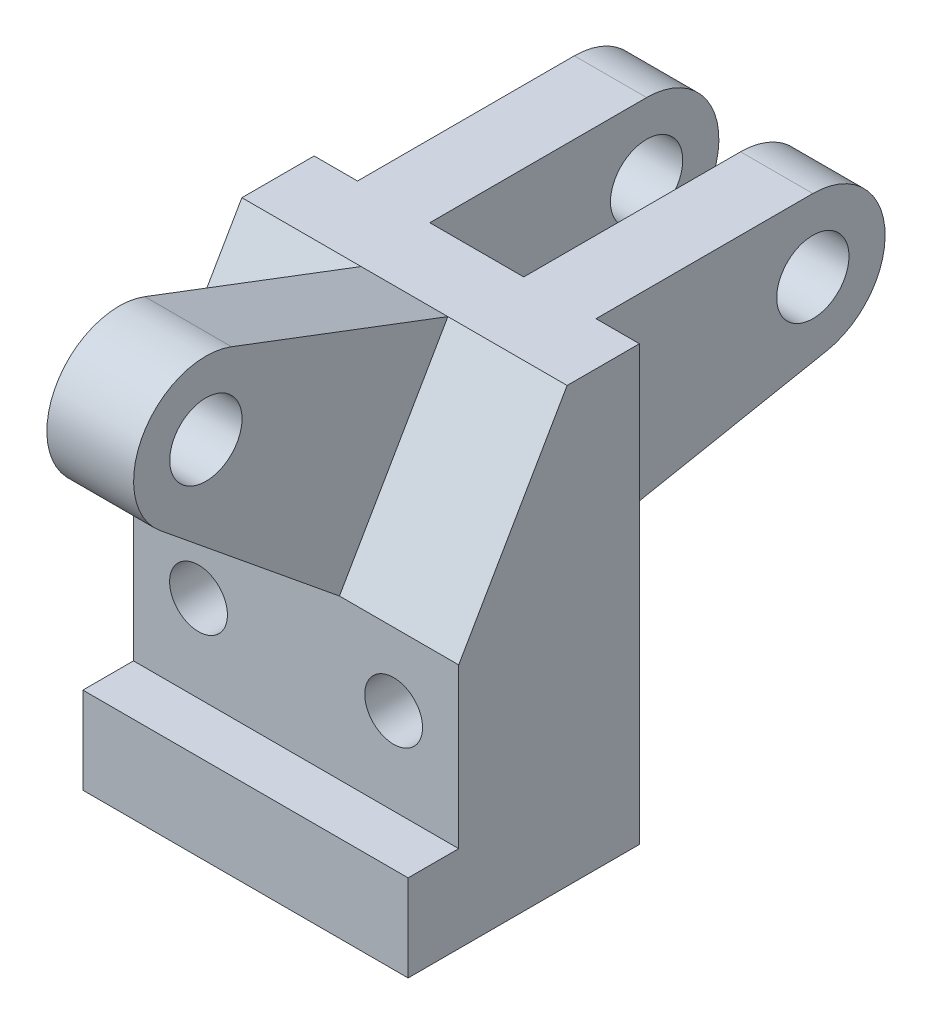
ISO-10303-21;
HEADER;
FILE_DESCRIPTION(('STEP AP214'),'2;1');
FILE_NAME('part.step','',(''),(''),'','','');
FILE_SCHEMA(('AUTOMOTIVE_DESIGN { 1 0 10303 214 1 1 1 1 }'));
ENDSEC;
DATA;
#1=APPLICATION_CONTEXT('core data for automotive mechanical design processes');
#2=APPLICATION_PROTOCOL_DEFINITION('international standard','automotive_design',2000,#1);
#3=PRODUCT_CONTEXT('',#1,'mechanical');
#4=PRODUCT('Part','Part','',(#3));
#5=PRODUCT_RELATED_PRODUCT_CATEGORY('part','',(#4));
#6=PRODUCT_DEFINITION_FORMATION('','',#4);
#7=PRODUCT_DEFINITION_CONTEXT('part definition',#1,'design');
#8=PRODUCT_DEFINITION('design','',#6,#7);
#9=PRODUCT_DEFINITION_SHAPE('','',#8);
#10=(LENGTH_UNIT() NAMED_UNIT(*) SI_UNIT(.MILLI.,.METRE.));
#11=(NAMED_UNIT(*) PLANE_ANGLE_UNIT() SI_UNIT($,.RADIAN.));
#12=(NAMED_UNIT(*) SI_UNIT($,.STERADIAN.) SOLID_ANGLE_UNIT());
#13=UNCERTAINTY_MEASURE_WITH_UNIT(LENGTH_MEASURE(1.E-05),#10,'distance_accuracy_value','');
#14=(GEOMETRIC_REPRESENTATION_CONTEXT(3) GLOBAL_UNCERTAINTY_ASSIGNED_CONTEXT((#13)) GLOBAL_UNIT_ASSIGNED_CONTEXT((#10,
#11,#12)) REPRESENTATION_CONTEXT('',''));
#15=CARTESIAN_POINT('',(0.,0.,0.));
#16=DIRECTION('',(0.,0.,1.));
#17=DIRECTION('',(1.,0.,0.));
#18=AXIS2_PLACEMENT_3D('',#15,#16,#17);
#19=CARTESIAN_POINT('',(-22.5,34.0192378864669,25.));
#20=DIRECTION('',(0.,0.500000000000001,0.866025403784438));
#21=DIRECTION('',(0.,-0.866025403784438,0.500000000000001));
#22=AXIS2_PLACEMENT_3D('',#19,#20,#21);
#23=PLANE('',#22);
#24=DIRECTION('',(1.,0.,0.));
#25=VECTOR('',#24,1.);
#26=CARTESIAN_POINT('',(-22.5,34.0192378864669,25.));
#27=LINE('',#26,#25);
#28=CARTESIAN_POINT('',(-22.5,34.0192378864669,25.));
#29=VERTEX_POINT('',#28);
#30=CARTESIAN_POINT('',(-6.00000000000001,34.0192378864669,25.));
#31=VERTEX_POINT('',#30);
#32=EDGE_CURVE('E329',#29,#31,#27,.T.);
#33=ORIENTED_EDGE('',*,*,#32,.T.);
#34=DIRECTION('',(0.,0.866025403784438,-0.500000000000001));
#35=VECTOR('',#34,1.);
#36=CARTESIAN_POINT('',(-6.,60.,10.));
#37=LINE('',#36,#35);
#38=CARTESIAN_POINT('',(-6.00000000000001,60.,10.));
#39=VERTEX_POINT('',#38);
#40=EDGE_CURVE('E209',#31,#39,#37,.T.);
#41=ORIENTED_EDGE('',*,*,#40,.T.);
#42=DIRECTION('',(1.,0.,0.));
#43=VECTOR('',#42,1.);
#44=CARTESIAN_POINT('',(-22.5,60.,10.));
#45=LINE('',#44,#43);
#46=CARTESIAN_POINT('',(-22.5,60.,10.));
#47=VERTEX_POINT('',#46);
#48=EDGE_CURVE('E172',#47,#39,#45,.T.);
#49=ORIENTED_EDGE('',*,*,#48,.F.);
#50=DIRECTION('',(0.,-0.866025403784438,0.500000000000001));
#51=VECTOR('',#50,1.);
#52=CARTESIAN_POINT('',(-22.5,34.0192378864669,25.));
#53=LINE('',#52,#51);
#54=EDGE_CURVE('E287',#47,#29,#53,.T.);
#55=ORIENTED_EDGE('',*,*,#54,.T.);
#56=EDGE_LOOP('',(#33,#41,#49,#55));
#57=FACE_BOUND('',#56,.T.);
#58=ADVANCED_FACE('F33',(#57),#23,.T.);
#59=CARTESIAN_POINT('',(16.5,40.1826590955336,-31.9025818157154));
#60=DIRECTION('',(0.,0.98173409044664,0.190258181571541));
#61=DIRECTION('',(0.,-0.190258181571541,0.98173409044664));
#62=AXIS2_PLACEMENT_3D('',#59,#60,#61);
#63=PLANE('',#62);
#64=DIRECTION('',(-1.,0.,0.));
#65=VECTOR('',#64,1.);
#66=CARTESIAN_POINT('',(16.5,34.,0.));
#67=LINE('',#66,#65);
#68=CARTESIAN_POINT('',(16.5,34.,0.));
#69=VERTEX_POINT('',#68);
#70=CARTESIAN_POINT('',(6.5,34.,0.));
#71=VERTEX_POINT('',#70);
#72=EDGE_CURVE('E281',#69,#71,#67,.T.);
#73=ORIENTED_EDGE('',*,*,#72,.T.);
#74=DIRECTION('',(0.,0.190258181571541,-0.98173409044664));
#75=VECTOR('',#74,1.);
#76=CARTESIAN_POINT('',(6.5,40.1826590955336,-31.9025818157154));
#77=LINE('',#76,#75);
#78=CARTESIAN_POINT('',(6.5,40.1826590955336,-31.9025818157154));
#79=VERTEX_POINT('',#78);
#80=EDGE_CURVE('E241',#71,#79,#77,.T.);
#81=ORIENTED_EDGE('',*,*,#80,.T.);
#82=DIRECTION('',(-1.,0.,0.));
#83=VECTOR('',#82,1.);
#84=CARTESIAN_POINT('',(16.5,40.1826590955336,-31.9025818157154));
#85=LINE('',#84,#83);
#86=CARTESIAN_POINT('',(16.5,40.1826590955336,-31.9025818157154));
#87=VERTEX_POINT('',#86);
#88=EDGE_CURVE('E277',#87,#79,#85,.T.);
#89=ORIENTED_EDGE('',*,*,#88,.F.);
#90=DIRECTION('',(0.,0.190258181571541,-0.98173409044664));
#91=VECTOR('',#90,1.);
#92=CARTESIAN_POINT('',(16.5,40.1826590955336,-31.9025818157154));
#93=LINE('',#92,#91);
#94=EDGE_CURVE('E254',#69,#87,#93,.T.);
#95=ORIENTED_EDGE('',*,*,#94,.F.);
#96=EDGE_LOOP('',(#73,#81,#89,#95));
#97=FACE_BOUND('',#96,.T.);
#98=ADVANCED_FACE('F358',(#97),#63,.F.);
#99=CARTESIAN_POINT('',(16.5,50.,-30.));
#100=DIRECTION('',(-1.,0.,0.));
#101=DIRECTION('',(0.,0.,1.));
#102=AXIS2_PLACEMENT_3D('',#99,#100,#101);
#103=CYLINDRICAL_SURFACE('',#102,10.);
#104=ORIENTED_EDGE('',*,*,#88,.T.);
#105=CARTESIAN_POINT('',(6.5,50.,-30.));
#106=DIRECTION('',(1.,0.,0.));
#107=DIRECTION('',(0.,0.,-1.));
#108=AXIS2_PLACEMENT_3D('',#105,#106,#107);
#109=CIRCLE('',#108,10.);
#110=CARTESIAN_POINT('',(6.5,60.,-30.));
#111=VERTEX_POINT('',#110);
#112=EDGE_CURVE('E238',#79,#111,#109,.T.);
#113=ORIENTED_EDGE('',*,*,#112,.T.);
#114=DIRECTION('',(-1.,0.,0.));
#115=VECTOR('',#114,1.);
#116=CARTESIAN_POINT('',(16.5,60.,-30.));
#117=LINE('',#116,#115);
#118=CARTESIAN_POINT('',(16.5,60.,-30.));
#119=VERTEX_POINT('',#118);
#120=EDGE_CURVE('E273',#119,#111,#117,.T.);
#121=ORIENTED_EDGE('',*,*,#120,.F.);
#122=CARTESIAN_POINT('',(16.5,50.,-30.));
#123=DIRECTION('',(1.,0.,0.));
#124=DIRECTION('',(0.,0.,1.));
#125=AXIS2_PLACEMENT_3D('',#122,#123,#124);
#126=CIRCLE('',#125,10.);
#127=EDGE_CURVE('E257',#87,#119,#126,.T.);
#128=ORIENTED_EDGE('',*,*,#127,.F.);
#129=EDGE_LOOP('',(#104,#113,#121,#128));
#130=FACE_BOUND('',#129,.T.);
#131=ADVANCED_FACE('F369',(#130),#103,.T.);
#132=CARTESIAN_POINT('',(16.5,50.,-30.));
#133=DIRECTION('',(-1.,0.,0.));
#134=DIRECTION('',(0.,0.,1.));
#135=AXIS2_PLACEMENT_3D('',#132,#133,#134);
#136=CYLINDRICAL_SURFACE('',#135,5.);
#137=CARTESIAN_POINT('',(6.5,50.,-30.));
#138=DIRECTION('',(1.,0.,0.));
#139=DIRECTION('',(0.,0.,-1.));
#140=AXIS2_PLACEMENT_3D('',#137,#138,#139);
#141=CIRCLE('',#140,5.);
#142=CARTESIAN_POINT('',(6.5,50.,-35.));
#143=VERTEX_POINT('',#142);
#144=EDGE_CURVE('E37',#143,#143,#141,.T.);
#145=ORIENTED_EDGE('',*,*,#144,.F.);
#146=EDGE_LOOP('',(#145));
#147=FACE_BOUND('',#146,.T.);
#148=CARTESIAN_POINT('',(16.5,50.,-30.));
#149=DIRECTION('',(1.,0.,0.));
#150=DIRECTION('',(0.,0.,-1.));
#151=AXIS2_PLACEMENT_3D('',#148,#149,#150);
#152=CIRCLE('',#151,5.);
#153=CARTESIAN_POINT('',(16.5,50.,-35.));
#154=VERTEX_POINT('',#153);
#155=EDGE_CURVE('E245',#154,#154,#152,.T.);
#156=ORIENTED_EDGE('',*,*,#155,.T.);
#157=EDGE_LOOP('',(#156));
#158=FACE_BOUND('',#157,.T.);
#159=ADVANCED_FACE('F343',(#147,#158),#136,.F.);
#160=CARTESIAN_POINT('',(-22.5,60.,0.));
#161=DIRECTION('',(0.,0.,-1.));
#162=DIRECTION('',(0.,1.,0.));
#163=AXIS2_PLACEMENT_3D('',#160,#161,#162);
#164=PLANE('',#163);
#165=CARTESIAN_POINT('',(13.5,24.,0.));
#166=DIRECTION('',(0.,0.,-1.));
#167=DIRECTION('',(0.,1.,0.));
#168=AXIS2_PLACEMENT_3D('',#165,#166,#167);
#169=CIRCLE('',#168,4.);
#170=CARTESIAN_POINT('',(13.5,28.,0.));
#171=VERTEX_POINT('',#170);
#172=EDGE_CURVE('E482',#171,#171,#169,.T.);
#173=ORIENTED_EDGE('',*,*,#172,.F.);
#174=EDGE_LOOP('',(#173));
#175=FACE_BOUND('',#174,.T.);
#176=CARTESIAN_POINT('',(-13.5,24.,0.));
#177=DIRECTION('',(0.,0.,-1.));
#178=DIRECTION('',(0.,1.,0.));
#179=AXIS2_PLACEMENT_3D('',#176,#177,#178);
#180=CIRCLE('',#179,4.);
#181=CARTESIAN_POINT('',(-13.5,28.,0.));
#182=VERTEX_POINT('',#181);
#183=EDGE_CURVE('E491',#182,#182,#180,.T.);
#184=ORIENTED_EDGE('',*,*,#183,.F.);
#185=EDGE_LOOP('',(#184));
#186=FACE_BOUND('',#185,.T.);
#187=CARTESIAN_POINT('',(-6.5,34.,0.));
#188=VERTEX_POINT('',#187);
#189=CARTESIAN_POINT('',(-16.5,34.,0.));
#190=VERTEX_POINT('',#189);
#191=EDGE_CURVE('E280',#188,#190,#67,.T.);
#192=ORIENTED_EDGE('',*,*,#191,.F.);
#193=DIRECTION('',(0.,1.,0.));
#194=VECTOR('',#193,1.);
#195=CARTESIAN_POINT('',(-6.5,0.,0.));
#196=LINE('',#195,#194);
#197=CARTESIAN_POINT('',(-6.5,60.,0.));
#198=VERTEX_POINT('',#197);
#199=EDGE_CURVE('E227',#188,#198,#196,.T.);
#200=ORIENTED_EDGE('',*,*,#199,.T.);
#201=DIRECTION('',(1.,0.,0.));
#202=VECTOR('',#201,1.);
#203=CARTESIAN_POINT('',(6.5,60.,0.));
#204=LINE('',#203,#202);
#205=CARTESIAN_POINT('',(6.5,60.,0.));
#206=VERTEX_POINT('',#205);
#207=EDGE_CURVE('E224',#198,#206,#204,.T.);
#208=ORIENTED_EDGE('',*,*,#207,.T.);
#209=DIRECTION('',(0.,1.,0.));
#210=VECTOR('',#209,1.);
#211=CARTESIAN_POINT('',(6.5,0.,0.));
#212=LINE('',#211,#210);
#213=EDGE_CURVE('E228',#71,#206,#212,.T.);
#214=ORIENTED_EDGE('',*,*,#213,.F.);
#215=ORIENTED_EDGE('',*,*,#72,.F.);
#216=DIRECTION('',(0.,-1.,0.));
#217=VECTOR('',#216,1.);
#218=CARTESIAN_POINT('',(16.5,60.,0.));
#219=LINE('',#218,#217);
#220=CARTESIAN_POINT('',(16.5,60.,0.));
#221=VERTEX_POINT('',#220);
#222=EDGE_CURVE('E251',#221,#69,#219,.T.);
#223=ORIENTED_EDGE('',*,*,#222,.F.);
#224=DIRECTION('',(1.,0.,0.));
#225=VECTOR('',#224,1.);
#226=CARTESIAN_POINT('',(-22.5,60.,0.));
#227=LINE('',#226,#225);
#228=CARTESIAN_POINT('',(22.5,60.,0.));
#229=VERTEX_POINT('',#228);
#230=EDGE_CURVE('E42',#221,#229,#227,.T.);
#231=ORIENTED_EDGE('',*,*,#230,.T.);
#232=DIRECTION('',(0.,1.,0.));
#233=VECTOR('',#232,1.);
#234=CARTESIAN_POINT('',(22.5,60.,0.));
#235=LINE('',#234,#233);
#236=CARTESIAN_POINT('',(22.5,0.,0.));
#237=VERTEX_POINT('',#236);
#238=EDGE_CURVE('E288',#237,#229,#235,.T.);
#239=ORIENTED_EDGE('',*,*,#238,.F.);
#240=DIRECTION('',(1.,0.,0.));
#241=VECTOR('',#240,1.);
#242=CARTESIAN_POINT('',(-22.5,0.,0.));
#243=LINE('',#242,#241);
#244=CARTESIAN_POINT('',(-22.5,0.,0.));
#245=VERTEX_POINT('',#244);
#246=EDGE_CURVE('E321',#245,#237,#243,.T.);
#247=ORIENTED_EDGE('',*,*,#246,.F.);
#248=DIRECTION('',(0.,1.,0.));
#249=VECTOR('',#248,1.);
#250=CARTESIAN_POINT('',(-22.5,60.,0.));
#251=LINE('',#250,#249);
#252=CARTESIAN_POINT('',(-22.5,60.,0.));
#253=VERTEX_POINT('',#252);
#254=EDGE_CURVE('E183',#245,#253,#251,.T.);
#255=ORIENTED_EDGE('',*,*,#254,.T.);
#256=CARTESIAN_POINT('',(-16.5,60.,0.));
#257=VERTEX_POINT('',#256);
#258=EDGE_CURVE('E11',#253,#257,#227,.T.);
#259=ORIENTED_EDGE('',*,*,#258,.T.);
#260=DIRECTION('',(0.,-1.,0.));
#261=VECTOR('',#260,1.);
#262=CARTESIAN_POINT('',(-16.5,60.,0.));
#263=LINE('',#262,#261);
#264=EDGE_CURVE('E248',#257,#190,#263,.T.);
#265=ORIENTED_EDGE('',*,*,#264,.T.);
#266=EDGE_LOOP('',(#192,#200,#208,#214,#215,#223,#231,#239,#247,#255,#259,#265));
#267=FACE_BOUND('',#266,.T.);
#268=ADVANCED_FACE('F399',(#175,#186,#267),#164,.T.);
#269=CARTESIAN_POINT('',(-22.5,60.,10.));
#270=DIRECTION('',(0.,1.,0.));
#271=DIRECTION('',(0.,0.,1.));
#272=AXIS2_PLACEMENT_3D('',#269,#270,#271);
#273=PLANE('',#272);
#274=DIRECTION('',(0.,0.,-1.));
#275=VECTOR('',#274,1.);
#276=CARTESIAN_POINT('',(6.5,60.,0.));
#277=LINE('',#276,#275);
#278=EDGE_CURVE('E176',#206,#111,#277,.T.);
#279=ORIENTED_EDGE('',*,*,#278,.F.);
#280=ORIENTED_EDGE('',*,*,#207,.F.);
#281=DIRECTION('',(0.,0.,1.));
#282=VECTOR('',#281,1.);
#283=CARTESIAN_POINT('',(-6.5,60.,0.));
#284=LINE('',#283,#282);
#285=CARTESIAN_POINT('',(-6.5,60.,-30.));
#286=VERTEX_POINT('',#285);
#287=EDGE_CURVE('E221',#286,#198,#284,.T.);
#288=ORIENTED_EDGE('',*,*,#287,.F.);
#289=CARTESIAN_POINT('',(-16.5,60.,-30.));
#290=VERTEX_POINT('',#289);
#291=EDGE_CURVE('E262',#286,#290,#117,.T.);
#292=ORIENTED_EDGE('',*,*,#291,.T.);
#293=DIRECTION('',(0.,0.,1.));
#294=VECTOR('',#293,1.);
#295=CARTESIAN_POINT('',(-16.5,60.,0.));
#296=LINE('',#295,#294);
#297=EDGE_CURVE('E255',#290,#257,#296,.T.);
#298=ORIENTED_EDGE('',*,*,#297,.T.);
#299=ORIENTED_EDGE('',*,*,#258,.F.);
#300=DIRECTION('',(0.,0.,1.));
#301=VECTOR('',#300,1.);
#302=CARTESIAN_POINT('',(-22.5,60.,10.));
#303=LINE('',#302,#301);
#304=EDGE_CURVE('E285',#253,#47,#303,.T.);
#305=ORIENTED_EDGE('',*,*,#304,.T.);
#306=ORIENTED_EDGE('',*,*,#48,.T.);
#307=DIRECTION('',(-1.,0.,0.));
#308=VECTOR('',#307,1.);
#309=CARTESIAN_POINT('',(6.,60.,10.));
#310=LINE('',#309,#308);
#311=CARTESIAN_POINT('',(6.,60.,10.));
#312=VERTEX_POINT('',#311);
#313=EDGE_CURVE('E166',#312,#39,#310,.T.);
#314=ORIENTED_EDGE('',*,*,#313,.F.);
#315=CARTESIAN_POINT('',(22.5,60.,10.));
#316=VERTEX_POINT('',#315);
#317=EDGE_CURVE('E169',#312,#316,#45,.T.);
#318=ORIENTED_EDGE('',*,*,#317,.T.);
#319=DIRECTION('',(0.,0.,1.));
#320=VECTOR('',#319,1.);
#321=CARTESIAN_POINT('',(22.5,60.,10.));
#322=LINE('',#321,#320);
#323=EDGE_CURVE('E284',#229,#316,#322,.T.);
#324=ORIENTED_EDGE('',*,*,#323,.F.);
#325=ORIENTED_EDGE('',*,*,#230,.F.);
#326=DIRECTION('',(0.,0.,1.));
#327=VECTOR('',#326,1.);
#328=CARTESIAN_POINT('',(16.5,60.,0.));
#329=LINE('',#328,#327);
#330=EDGE_CURVE('E259',#119,#221,#329,.T.);
#331=ORIENTED_EDGE('',*,*,#330,.F.);
#332=ORIENTED_EDGE('',*,*,#120,.T.);
#333=EDGE_LOOP('',(#279,#280,#288,#292,#298,#299,#305,#306,#314,#318,#324,#325,#331,#332));
#334=FACE_BOUND('',#333,.T.);
#335=ADVANCED_FACE('F35',(#334),#273,.T.);
#336=CARTESIAN_POINT('',(-22.5,0.,0.));
#337=DIRECTION('',(0.,-1.,0.));
#338=DIRECTION('',(0.,0.,-1.));
#339=AXIS2_PLACEMENT_3D('',#336,#337,#338);
#340=PLANE('',#339);
#341=DIRECTION('',(0.,0.,-1.));
#342=VECTOR('',#341,1.);
#343=CARTESIAN_POINT('',(22.5,0.,0.));
#344=LINE('',#343,#342);
#345=CARTESIAN_POINT('',(22.5,0.,32.));
#346=VERTEX_POINT('',#345);
#347=EDGE_CURVE('E316',#346,#237,#344,.T.);
#348=ORIENTED_EDGE('',*,*,#347,.F.);
#349=DIRECTION('',(1.,0.,0.));
#350=VECTOR('',#349,1.);
#351=CARTESIAN_POINT('',(-22.5,0.,32.));
#352=LINE('',#351,#350);
#353=CARTESIAN_POINT('',(-22.5,0.,32.));
#354=VERTEX_POINT('',#353);
#355=EDGE_CURVE('E323',#354,#346,#352,.T.);
#356=ORIENTED_EDGE('',*,*,#355,.F.);
#357=DIRECTION('',(0.,0.,-1.));
#358=VECTOR('',#357,1.);
#359=CARTESIAN_POINT('',(-22.5,0.,0.));
#360=LINE('',#359,#358);
#361=EDGE_CURVE('E300',#354,#245,#360,.T.);
#362=ORIENTED_EDGE('',*,*,#361,.T.);
#363=ORIENTED_EDGE('',*,*,#246,.T.);
#364=EDGE_LOOP('',(#348,#356,#362,#363));
#365=FACE_BOUND('',#364,.T.);
#366=ADVANCED_FACE('F394',(#365),#340,.T.);
#367=CARTESIAN_POINT('',(-22.5,0.,32.));
#368=DIRECTION('',(0.,0.,1.));
#369=DIRECTION('',(1.,0.,0.));
#370=AXIS2_PLACEMENT_3D('',#367,#368,#369);
#371=PLANE('',#370);
#372=DIRECTION('',(0.,-1.,0.));
#373=VECTOR('',#372,1.);
#374=CARTESIAN_POINT('',(22.5,0.,32.));
#375=LINE('',#374,#373);
#376=CARTESIAN_POINT('',(22.5,12.,32.));
#377=VERTEX_POINT('',#376);
#378=EDGE_CURVE('E313',#377,#346,#375,.T.);
#379=ORIENTED_EDGE('',*,*,#378,.F.);
#380=DIRECTION('',(1.,0.,0.));
#381=VECTOR('',#380,1.);
#382=CARTESIAN_POINT('',(-22.5,12.,32.));
#383=LINE('',#382,#381);
#384=CARTESIAN_POINT('',(-22.5,12.,32.));
#385=VERTEX_POINT('',#384);
#386=EDGE_CURVE('E325',#385,#377,#383,.T.);
#387=ORIENTED_EDGE('',*,*,#386,.F.);
#388=DIRECTION('',(0.,-1.,0.));
#389=VECTOR('',#388,1.);
#390=CARTESIAN_POINT('',(-22.5,0.,32.));
#391=LINE('',#390,#389);
#392=EDGE_CURVE('E297',#385,#354,#391,.T.);
#393=ORIENTED_EDGE('',*,*,#392,.T.);
#394=ORIENTED_EDGE('',*,*,#355,.T.);
#395=EDGE_LOOP('',(#379,#387,#393,#394));
#396=FACE_BOUND('',#395,.T.);
#397=ADVANCED_FACE('F386',(#396),#371,.T.);
#398=CARTESIAN_POINT('',(-22.5,12.,32.));
#399=DIRECTION('',(0.,1.,0.));
#400=DIRECTION('',(0.,0.,1.));
#401=AXIS2_PLACEMENT_3D('',#398,#399,#400);
#402=PLANE('',#401);
#403=DIRECTION('',(0.,0.,1.));
#404=VECTOR('',#403,1.);
#405=CARTESIAN_POINT('',(22.5,12.,32.));
#406=LINE('',#405,#404);
#407=CARTESIAN_POINT('',(22.5,12.,25.));
#408=VERTEX_POINT('',#407);
#409=EDGE_CURVE('E310',#408,#377,#406,.T.);
#410=ORIENTED_EDGE('',*,*,#409,.F.);
#411=DIRECTION('',(1.,0.,0.));
#412=VECTOR('',#411,1.);
#413=CARTESIAN_POINT('',(-22.5,12.,25.));
#414=LINE('',#413,#412);
#415=CARTESIAN_POINT('',(-22.5,12.,25.));
#416=VERTEX_POINT('',#415);
#417=EDGE_CURVE('E327',#416,#408,#414,.T.);
#418=ORIENTED_EDGE('',*,*,#417,.F.);
#419=DIRECTION('',(0.,0.,1.));
#420=VECTOR('',#419,1.);
#421=CARTESIAN_POINT('',(-22.5,12.,32.));
#422=LINE('',#421,#420);
#423=EDGE_CURVE('E294',#416,#385,#422,.T.);
#424=ORIENTED_EDGE('',*,*,#423,.T.);
#425=ORIENTED_EDGE('',*,*,#386,.T.);
#426=EDGE_LOOP('',(#410,#418,#424,#425));
#427=FACE_BOUND('',#426,.T.);
#428=ADVANCED_FACE('F381',(#427),#402,.T.);
#429=CARTESIAN_POINT('',(-22.5,12.,25.));
#430=DIRECTION('',(0.,0.,1.));
#431=DIRECTION('',(1.,0.,0.));
#432=AXIS2_PLACEMENT_3D('',#429,#430,#431);
#433=PLANE('',#432);
#434=CARTESIAN_POINT('',(13.5,24.,25.));
#435=DIRECTION('',(0.,0.,1.));
#436=DIRECTION('',(1.,0.,0.));
#437=AXIS2_PLACEMENT_3D('',#434,#435,#436);
#438=CIRCLE('',#437,4.);
#439=CARTESIAN_POINT('',(17.5,24.,25.));
#440=VERTEX_POINT('',#439);
#441=EDGE_CURVE('E484',#440,#440,#438,.T.);
#442=ORIENTED_EDGE('',*,*,#441,.F.);
#443=EDGE_LOOP('',(#442));
#444=FACE_BOUND('',#443,.T.);
#445=CARTESIAN_POINT('',(-13.5,24.,25.));
#446=DIRECTION('',(0.,0.,1.));
#447=DIRECTION('',(1.,0.,0.));
#448=AXIS2_PLACEMENT_3D('',#445,#446,#447);
#449=CIRCLE('',#448,4.);
#450=CARTESIAN_POINT('',(-9.5,24.,25.));
#451=VERTEX_POINT('',#450);
#452=EDGE_CURVE('E486',#451,#451,#449,.T.);
#453=ORIENTED_EDGE('',*,*,#452,.F.);
#454=EDGE_LOOP('',(#453));
#455=FACE_BOUND('',#454,.T.);
#456=DIRECTION('',(0.,-1.,0.));
#457=VECTOR('',#456,1.);
#458=CARTESIAN_POINT('',(22.5,12.,25.));
#459=LINE('',#458,#457);
#460=CARTESIAN_POINT('',(22.5,34.0192378864669,25.));
#461=VERTEX_POINT('',#460);
#462=EDGE_CURVE('E307',#461,#408,#459,.T.);
#463=ORIENTED_EDGE('',*,*,#462,.F.);
#464=CARTESIAN_POINT('',(5.99999999999999,34.0192378864669,25.));
#465=VERTEX_POINT('',#464);
#466=EDGE_CURVE('E330',#465,#461,#27,.T.);
#467=ORIENTED_EDGE('',*,*,#466,.F.);
#468=DIRECTION('',(-1.,0.,0.));
#469=VECTOR('',#468,1.);
#470=CARTESIAN_POINT('',(6.,34.0192378864669,25.));
#471=LINE('',#470,#469);
#472=EDGE_CURVE('E57',#465,#31,#471,.T.);
#473=ORIENTED_EDGE('',*,*,#472,.T.);
#474=ORIENTED_EDGE('',*,*,#32,.F.);
#475=DIRECTION('',(0.,-1.,0.));
#476=VECTOR('',#475,1.);
#477=CARTESIAN_POINT('',(-22.5,12.,25.));
#478=LINE('',#477,#476);
#479=EDGE_CURVE('E291',#29,#416,#478,.T.);
#480=ORIENTED_EDGE('',*,*,#479,.T.);
#481=ORIENTED_EDGE('',*,*,#417,.T.);
#482=EDGE_LOOP('',(#463,#467,#473,#474,#480,#481));
#483=FACE_BOUND('',#482,.T.);
#484=ADVANCED_FACE('F374',(#444,#455,#483),#433,.T.);
#485=DIRECTION('',(0.,0.866025403784438,-0.500000000000001));
#486=VECTOR('',#485,1.);
#487=CARTESIAN_POINT('',(6.,60.,10.));
#488=LINE('',#487,#486);
#489=EDGE_CURVE('E50',#465,#312,#488,.T.);
#490=ORIENTED_EDGE('',*,*,#489,.F.);
#491=ORIENTED_EDGE('',*,*,#466,.T.);
#492=DIRECTION('',(0.,-0.866025403784438,0.500000000000001));
#493=VECTOR('',#492,1.);
#494=CARTESIAN_POINT('',(22.5,34.0192378864669,25.));
#495=LINE('',#494,#493);
#496=EDGE_CURVE('E181',#316,#461,#495,.T.);
#497=ORIENTED_EDGE('',*,*,#496,.F.);
#498=ORIENTED_EDGE('',*,*,#317,.F.);
#499=EDGE_LOOP('',(#490,#491,#497,#498));
#500=FACE_BOUND('',#499,.T.);
#501=ADVANCED_FACE('F179',(#500),#23,.T.);
#502=CARTESIAN_POINT('',(-22.5,0.,0.));
#503=DIRECTION('',(-1.,0.,0.));
#504=DIRECTION('',(0.,0.,1.));
#505=AXIS2_PLACEMENT_3D('',#502,#503,#504);
#506=PLANE('',#505);
#507=ORIENTED_EDGE('',*,*,#304,.F.);
#508=ORIENTED_EDGE('',*,*,#254,.F.);
#509=ORIENTED_EDGE('',*,*,#361,.F.);
#510=ORIENTED_EDGE('',*,*,#392,.F.);
#511=ORIENTED_EDGE('',*,*,#423,.F.);
#512=ORIENTED_EDGE('',*,*,#479,.F.);
#513=ORIENTED_EDGE('',*,*,#54,.F.);
#514=EDGE_LOOP('',(#507,#508,#509,#510,#511,#512,#513));
#515=FACE_BOUND('',#514,.T.);
#516=ADVANCED_FACE('F373',(#515),#506,.T.);
#517=CARTESIAN_POINT('',(22.5,0.,0.));
#518=DIRECTION('',(-1.,0.,0.));
#519=DIRECTION('',(0.,0.,1.));
#520=AXIS2_PLACEMENT_3D('',#517,#518,#519);
#521=PLANE('',#520);
#522=ORIENTED_EDGE('',*,*,#323,.T.);
#523=ORIENTED_EDGE('',*,*,#496,.T.);
#524=ORIENTED_EDGE('',*,*,#462,.T.);
#525=ORIENTED_EDGE('',*,*,#409,.T.);
#526=ORIENTED_EDGE('',*,*,#378,.T.);
#527=ORIENTED_EDGE('',*,*,#347,.T.);
#528=ORIENTED_EDGE('',*,*,#238,.T.);
#529=EDGE_LOOP('',(#522,#523,#524,#525,#526,#527,#528));
#530=FACE_BOUND('',#529,.T.);
#531=ADVANCED_FACE('F359',(#530),#521,.F.);
#532=CARTESIAN_POINT('',(16.5,50.,-30.));
#533=DIRECTION('',(-1.,0.,0.));
#534=DIRECTION('',(0.,0.,1.));
#535=AXIS2_PLACEMENT_3D('',#532,#533,#534);
#536=PLANE('',#535);
#537=ORIENTED_EDGE('',*,*,#222,.T.);
#538=ORIENTED_EDGE('',*,*,#94,.T.);
#539=ORIENTED_EDGE('',*,*,#127,.T.);
#540=ORIENTED_EDGE('',*,*,#330,.T.);
#541=EDGE_LOOP('',(#537,#538,#539,#540));
#542=FACE_BOUND('',#541,.T.);
#543=ORIENTED_EDGE('',*,*,#155,.F.);
#544=EDGE_LOOP('',(#543));
#545=FACE_BOUND('',#544,.T.);
#546=ADVANCED_FACE('F349',(#542,#545),#536,.F.);
#547=CARTESIAN_POINT('',(-16.5,50.,-30.));
#548=DIRECTION('',(-1.,0.,0.));
#549=DIRECTION('',(0.,0.,1.));
#550=AXIS2_PLACEMENT_3D('',#547,#548,#549);
#551=PLANE('',#550);
#552=ORIENTED_EDGE('',*,*,#264,.F.);
#553=ORIENTED_EDGE('',*,*,#297,.F.);
#554=CARTESIAN_POINT('',(-16.5,50.,-30.));
#555=DIRECTION('',(1.,0.,0.));
#556=DIRECTION('',(0.,0.,1.));
#557=AXIS2_PLACEMENT_3D('',#554,#555,#556);
#558=CIRCLE('',#557,10.);
#559=CARTESIAN_POINT('',(-16.5,40.1826590955336,-31.9025818157154));
#560=VERTEX_POINT('',#559);
#561=EDGE_CURVE('E268',#560,#290,#558,.T.);
#562=ORIENTED_EDGE('',*,*,#561,.F.);
#563=DIRECTION('',(0.,0.190258181571541,-0.98173409044664));
#564=VECTOR('',#563,1.);
#565=CARTESIAN_POINT('',(-16.5,40.1826590955336,-31.9025818157154));
#566=LINE('',#565,#564);
#567=EDGE_CURVE('E265',#190,#560,#566,.T.);
#568=ORIENTED_EDGE('',*,*,#567,.F.);
#569=EDGE_LOOP('',(#552,#553,#562,#568));
#570=FACE_BOUND('',#569,.T.);
#571=CARTESIAN_POINT('',(-16.5,50.,-30.));
#572=DIRECTION('',(1.,0.,0.));
#573=DIRECTION('',(0.,0.,-1.));
#574=AXIS2_PLACEMENT_3D('',#571,#572,#573);
#575=CIRCLE('',#574,5.);
#576=CARTESIAN_POINT('',(-16.5,50.,-35.));
#577=VERTEX_POINT('',#576);
#578=EDGE_CURVE('E244',#577,#577,#575,.T.);
#579=ORIENTED_EDGE('',*,*,#578,.T.);
#580=EDGE_LOOP('',(#579));
#581=FACE_BOUND('',#580,.T.);
#582=ADVANCED_FACE('F346',(#570,#581),#551,.T.);
#583=CARTESIAN_POINT('',(-6.5,40.1826590955336,-31.9025818157154));
#584=VERTEX_POINT('',#583);
#585=EDGE_CURVE('E276',#584,#560,#85,.T.);
#586=ORIENTED_EDGE('',*,*,#585,.F.);
#587=DIRECTION('',(0.,-0.190258181571541,0.98173409044664));
#588=VECTOR('',#587,1.);
#589=CARTESIAN_POINT('',(-6.5,40.1826590955336,-31.9025818157154));
#590=LINE('',#589,#588);
#591=EDGE_CURVE('E235',#584,#188,#590,.T.);
#592=ORIENTED_EDGE('',*,*,#591,.T.);
#593=ORIENTED_EDGE('',*,*,#191,.T.);
#594=ORIENTED_EDGE('',*,*,#567,.T.);
#595=EDGE_LOOP('',(#586,#592,#593,#594));
#596=FACE_BOUND('',#595,.T.);
#597=ADVANCED_FACE('F348',(#596),#63,.F.);
#598=ORIENTED_EDGE('',*,*,#291,.F.);
#599=CARTESIAN_POINT('',(-6.5,50.,-30.));
#600=DIRECTION('',(-1.,0.,0.));
#601=DIRECTION('',(0.,0.,1.));
#602=AXIS2_PLACEMENT_3D('',#599,#600,#601);
#603=CIRCLE('',#602,10.);
#604=EDGE_CURVE('E232',#286,#584,#603,.T.);
#605=ORIENTED_EDGE('',*,*,#604,.T.);
#606=ORIENTED_EDGE('',*,*,#585,.T.);
#607=ORIENTED_EDGE('',*,*,#561,.T.);
#608=EDGE_LOOP('',(#598,#605,#606,#607));
#609=FACE_BOUND('',#608,.T.);
#610=ADVANCED_FACE('F341',(#609),#103,.T.);
#611=CARTESIAN_POINT('',(-6.5,50.,-30.));
#612=DIRECTION('',(-1.,0.,0.));
#613=DIRECTION('',(0.,0.,1.));
#614=AXIS2_PLACEMENT_3D('',#611,#612,#613);
#615=CIRCLE('',#614,5.);
#616=CARTESIAN_POINT('',(-6.5,50.,-25.));
#617=VERTEX_POINT('',#616);
#618=EDGE_CURVE('E230',#617,#617,#615,.T.);
#619=ORIENTED_EDGE('',*,*,#618,.F.);
#620=EDGE_LOOP('',(#619));
#621=FACE_BOUND('',#620,.T.);
#622=ORIENTED_EDGE('',*,*,#578,.F.);
#623=EDGE_LOOP('',(#622));
#624=FACE_BOUND('',#623,.T.);
#625=ADVANCED_FACE('F337',(#621,#624),#136,.F.);
#626=CARTESIAN_POINT('',(6.5,0.,0.));
#627=DIRECTION('',(1.,0.,0.));
#628=DIRECTION('',(0.,0.,-1.));
#629=AXIS2_PLACEMENT_3D('',#626,#627,#628);
#630=PLANE('',#629);
#631=ORIENTED_EDGE('',*,*,#144,.T.);
#632=EDGE_LOOP('',(#631));
#633=FACE_BOUND('',#632,.T.);
#634=ORIENTED_EDGE('',*,*,#213,.T.);
#635=ORIENTED_EDGE('',*,*,#278,.T.);
#636=ORIENTED_EDGE('',*,*,#112,.F.);
#637=ORIENTED_EDGE('',*,*,#80,.F.);
#638=EDGE_LOOP('',(#634,#635,#636,#637));
#639=FACE_BOUND('',#638,.T.);
#640=ADVANCED_FACE('F340',(#633,#639),#630,.F.);
#641=CARTESIAN_POINT('',(-6.5,0.,0.));
#642=DIRECTION('',(-1.,0.,0.));
#643=DIRECTION('',(0.,0.,1.));
#644=AXIS2_PLACEMENT_3D('',#641,#642,#643);
#645=PLANE('',#644);
#646=ORIENTED_EDGE('',*,*,#618,.T.);
#647=EDGE_LOOP('',(#646));
#648=FACE_BOUND('',#647,.T.);
#649=ORIENTED_EDGE('',*,*,#604,.F.);
#650=ORIENTED_EDGE('',*,*,#287,.T.);
#651=ORIENTED_EDGE('',*,*,#199,.F.);
#652=ORIENTED_EDGE('',*,*,#591,.F.);
#653=EDGE_LOOP('',(#649,#650,#651,#652));
#654=FACE_BOUND('',#653,.T.);
#655=ADVANCED_FACE('F334',(#648,#654),#645,.F.);
#656=CARTESIAN_POINT('',(6.,62.0096189432335,43.4807621135331));
#657=DIRECTION('',(1.,0.,0.));
#658=DIRECTION('',(0.,0.,-1.));
#659=AXIS2_PLACEMENT_3D('',#656,#657,#658);
#660=PLANE('',#659);
#661=ORIENTED_EDGE('',*,*,#489,.T.);
#662=DIRECTION('',(0.,0.354797173291062,0.93494329551298));
#663=VECTOR('',#662,1.);
#664=CARTESIAN_POINT('',(6.,60.,10.));
#665=LINE('',#664,#663);
#666=CARTESIAN_POINT('',(6.,71.3590518983633,39.9327903806225));
#667=VERTEX_POINT('',#666);
#668=EDGE_CURVE('E186',#312,#667,#665,.T.);
#669=ORIENTED_EDGE('',*,*,#668,.T.);
#670=CARTESIAN_POINT('',(6.,62.0096189432335,43.4807621135331));
#671=DIRECTION('',(1.,0.,0.));
#672=DIRECTION('',(0.,0.,-1.));
#673=AXIS2_PLACEMENT_3D('',#670,#671,#672);
#674=CIRCLE('',#673,10.);
#675=CARTESIAN_POINT('',(6.,54.2622688130589,49.8036226971997));
#676=VERTEX_POINT('',#675);
#677=EDGE_CURVE('E191',#667,#676,#674,.T.);
#678=ORIENTED_EDGE('',*,*,#677,.T.);
#679=DIRECTION('',(0.,-0.632286058366653,-0.774735013017458));
#680=VECTOR('',#679,1.);
#681=CARTESIAN_POINT('',(6.,34.0192378864669,25.));
#682=LINE('',#681,#680);
#683=EDGE_CURVE('E197',#676,#465,#682,.T.);
#684=ORIENTED_EDGE('',*,*,#683,.T.);
#685=EDGE_LOOP('',(#661,#669,#678,#684));
#686=FACE_BOUND('',#685,.T.);
#687=CARTESIAN_POINT('',(6.,62.0096189432335,43.4807621135331));
#688=DIRECTION('',(1.,0.,0.));
#689=DIRECTION('',(0.,0.,-1.));
#690=AXIS2_PLACEMENT_3D('',#687,#688,#689);
#691=CIRCLE('',#690,5.);
#692=CARTESIAN_POINT('',(6.,62.0096189432335,38.4807621135332));
#693=VERTEX_POINT('',#692);
#694=EDGE_CURVE('E212',#693,#693,#691,.T.);
#695=ORIENTED_EDGE('',*,*,#694,.F.);
#696=EDGE_LOOP('',(#695));
#697=FACE_BOUND('',#696,.T.);
#698=ADVANCED_FACE('F194',(#686,#697),#660,.T.);
#699=CARTESIAN_POINT('',(-6.,62.0096189432335,43.4807621135331));
#700=DIRECTION('',(1.,0.,0.));
#701=DIRECTION('',(0.,0.,-1.));
#702=AXIS2_PLACEMENT_3D('',#699,#700,#701);
#703=PLANE('',#702);
#704=ORIENTED_EDGE('',*,*,#40,.F.);
#705=DIRECTION('',(0.,-0.632286058366653,-0.774735013017458));
#706=VECTOR('',#705,1.);
#707=CARTESIAN_POINT('',(-6.,34.0192378864669,25.));
#708=LINE('',#707,#706);
#709=CARTESIAN_POINT('',(-6.,54.2622688130589,49.8036226971997));
#710=VERTEX_POINT('',#709);
#711=EDGE_CURVE('E198',#710,#31,#708,.T.);
#712=ORIENTED_EDGE('',*,*,#711,.F.);
#713=CARTESIAN_POINT('',(-6.,62.0096189432335,43.4807621135331));
#714=DIRECTION('',(1.,0.,0.));
#715=DIRECTION('',(0.,0.,-1.));
#716=AXIS2_PLACEMENT_3D('',#713,#714,#715);
#717=CIRCLE('',#716,10.);
#718=CARTESIAN_POINT('',(-6.,71.3590518983633,39.9327903806225));
#719=VERTEX_POINT('',#718);
#720=EDGE_CURVE('E201',#719,#710,#717,.T.);
#721=ORIENTED_EDGE('',*,*,#720,.F.);
#722=DIRECTION('',(0.,0.354797173291062,0.93494329551298));
#723=VECTOR('',#722,1.);
#724=CARTESIAN_POINT('',(-6.,60.,10.));
#725=LINE('',#724,#723);
#726=EDGE_CURVE('E211',#39,#719,#725,.T.);
#727=ORIENTED_EDGE('',*,*,#726,.F.);
#728=EDGE_LOOP('',(#704,#712,#721,#727));
#729=FACE_BOUND('',#728,.T.);
#730=CARTESIAN_POINT('',(-6.,62.0096189432335,43.4807621135331));
#731=DIRECTION('',(1.,0.,0.));
#732=DIRECTION('',(0.,0.,-1.));
#733=AXIS2_PLACEMENT_3D('',#730,#731,#732);
#734=CIRCLE('',#733,5.);
#735=CARTESIAN_POINT('',(-6.,62.0096189432335,38.4807621135332));
#736=VERTEX_POINT('',#735);
#737=EDGE_CURVE('E204',#736,#736,#734,.T.);
#738=ORIENTED_EDGE('',*,*,#737,.T.);
#739=EDGE_LOOP('',(#738));
#740=FACE_BOUND('',#739,.T.);
#741=ADVANCED_FACE('F448',(#729,#740),#703,.F.);
#742=CARTESIAN_POINT('',(6.,60.,10.));
#743=DIRECTION('',(0.,-0.93494329551298,0.354797173291062));
#744=DIRECTION('',(0.,-0.354797173291062,-0.934943295512981));
#745=AXIS2_PLACEMENT_3D('',#742,#743,#744);
#746=PLANE('',#745);
#747=ORIENTED_EDGE('',*,*,#726,.T.);
#748=DIRECTION('',(-1.,0.,0.));
#749=VECTOR('',#748,1.);
#750=CARTESIAN_POINT('',(6.,71.3590518983633,39.9327903806225));
#751=LINE('',#750,#749);
#752=EDGE_CURVE('E177',#667,#719,#751,.T.);
#753=ORIENTED_EDGE('',*,*,#752,.F.);
#754=ORIENTED_EDGE('',*,*,#668,.F.);
#755=ORIENTED_EDGE('',*,*,#313,.T.);
#756=EDGE_LOOP('',(#747,#753,#754,#755));
#757=FACE_BOUND('',#756,.T.);
#758=ADVANCED_FACE('F187',(#757),#746,.F.);
#759=CARTESIAN_POINT('',(6.,62.0096189432335,43.4807621135331));
#760=DIRECTION('',(-1.,0.,0.));
#761=DIRECTION('',(0.,0.,1.));
#762=AXIS2_PLACEMENT_3D('',#759,#760,#761);
#763=CYLINDRICAL_SURFACE('',#762,10.);
#764=ORIENTED_EDGE('',*,*,#720,.T.);
#765=DIRECTION('',(-1.,0.,0.));
#766=VECTOR('',#765,1.);
#767=CARTESIAN_POINT('',(6.,54.2622688130589,49.8036226971997));
#768=LINE('',#767,#766);
#769=EDGE_CURVE('E216',#676,#710,#768,.T.);
#770=ORIENTED_EDGE('',*,*,#769,.F.);
#771=ORIENTED_EDGE('',*,*,#677,.F.);
#772=ORIENTED_EDGE('',*,*,#752,.T.);
#773=EDGE_LOOP('',(#764,#770,#771,#772));
#774=FACE_BOUND('',#773,.T.);
#775=ADVANCED_FACE('F455',(#774),#763,.T.);
#776=CARTESIAN_POINT('',(6.,34.0192378864669,25.));
#777=DIRECTION('',(0.,0.774735013017458,-0.632286058366653));
#778=DIRECTION('',(0.,0.632286058366653,0.774735013017458));
#779=AXIS2_PLACEMENT_3D('',#776,#777,#778);
#780=PLANE('',#779);
#781=ORIENTED_EDGE('',*,*,#711,.T.);
#782=ORIENTED_EDGE('',*,*,#472,.F.);
#783=ORIENTED_EDGE('',*,*,#683,.F.);
#784=ORIENTED_EDGE('',*,*,#769,.T.);
#785=EDGE_LOOP('',(#781,#782,#783,#784));
#786=FACE_BOUND('',#785,.T.);
#787=ADVANCED_FACE('F458',(#786),#780,.F.);
#788=CARTESIAN_POINT('',(6.,62.0096189432335,43.4807621135331));
#789=DIRECTION('',(-1.,0.,0.));
#790=DIRECTION('',(0.,0.,1.));
#791=AXIS2_PLACEMENT_3D('',#788,#789,#790);
#792=CYLINDRICAL_SURFACE('',#791,5.);
#793=ORIENTED_EDGE('',*,*,#694,.T.);
#794=EDGE_LOOP('',(#793));
#795=FACE_BOUND('',#794,.T.);
#796=ORIENTED_EDGE('',*,*,#737,.F.);
#797=EDGE_LOOP('',(#796));
#798=FACE_BOUND('',#797,.T.);
#799=ADVANCED_FACE('F462',(#795,#798),#792,.F.);
#800=CARTESIAN_POINT('',(-13.5,24.,-40.));
#801=DIRECTION('',(0.,0.,1.));
#802=DIRECTION('',(1.,0.,0.));
#803=AXIS2_PLACEMENT_3D('',#800,#801,#802);
#804=CYLINDRICAL_SURFACE('',#803,4.);
#805=ORIENTED_EDGE('',*,*,#183,.T.);
#806=EDGE_LOOP('',(#805));
#807=FACE_BOUND('',#806,.T.);
#808=ORIENTED_EDGE('',*,*,#452,.T.);
#809=EDGE_LOOP('',(#808));
#810=FACE_BOUND('',#809,.T.);
#811=ADVANCED_FACE('F469',(#807,#810),#804,.F.);
#812=CARTESIAN_POINT('',(13.5,24.,-40.));
#813=DIRECTION('',(0.,0.,1.));
#814=DIRECTION('',(1.,0.,0.));
#815=AXIS2_PLACEMENT_3D('',#812,#813,#814);
#816=CYLINDRICAL_SURFACE('',#815,4.);
#817=ORIENTED_EDGE('',*,*,#172,.T.);
#818=EDGE_LOOP('',(#817));
#819=FACE_BOUND('',#818,.T.);
#820=ORIENTED_EDGE('',*,*,#441,.T.);
#821=EDGE_LOOP('',(#820));
#822=FACE_BOUND('',#821,.T.);
#823=ADVANCED_FACE('F473',(#819,#822),#816,.F.);
#824=CLOSED_SHELL('',(#58,#98,#131,#159,#268,#335,#366,#397,#428,#484,#501,#516,#531,#546,#582,
#597,#610,#625,#640,#655,#698,#741,#758,#775,#787,#799,#811,#823));
#825=MANIFOLD_SOLID_BREP('B2',#824);
#826=ADVANCED_BREP_SHAPE_REPRESENTATION('',(#18,#825),#14);
#827=SHAPE_DEFINITION_REPRESENTATION(#9,#826);
ENDSEC;
END-ISO-10303-21;
